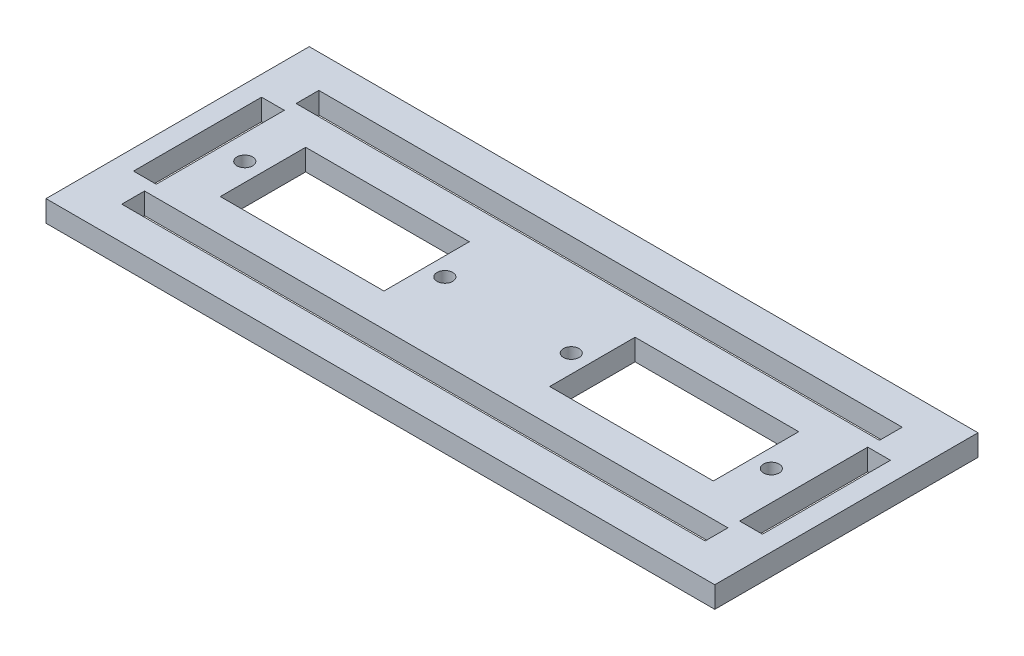
ISO-10303-21;
HEADER;
FILE_DESCRIPTION(('STEP AP214'),'2;1');
FILE_NAME('part.step','',(''),(''),'','','');
FILE_SCHEMA(('AUTOMOTIVE_DESIGN { 1 0 10303 214 1 1 1 1 }'));
ENDSEC;
DATA;
#1=APPLICATION_CONTEXT('core data for automotive mechanical design processes');
#2=APPLICATION_PROTOCOL_DEFINITION('international standard','automotive_design',2000,#1);
#3=PRODUCT_CONTEXT('',#1,'mechanical');
#4=PRODUCT('Part','Part','',(#3));
#5=PRODUCT_RELATED_PRODUCT_CATEGORY('part','',(#4));
#6=PRODUCT_DEFINITION_FORMATION('','',#4);
#7=PRODUCT_DEFINITION_CONTEXT('part definition',#1,'design');
#8=PRODUCT_DEFINITION('design','',#6,#7);
#9=PRODUCT_DEFINITION_SHAPE('','',#8);
#10=(LENGTH_UNIT() NAMED_UNIT(*) SI_UNIT(.MILLI.,.METRE.));
#11=(NAMED_UNIT(*) PLANE_ANGLE_UNIT() SI_UNIT($,.RADIAN.));
#12=(NAMED_UNIT(*) SI_UNIT($,.STERADIAN.) SOLID_ANGLE_UNIT());
#13=UNCERTAINTY_MEASURE_WITH_UNIT(LENGTH_MEASURE(1.E-05),#10,'distance_accuracy_value','');
#14=(GEOMETRIC_REPRESENTATION_CONTEXT(3) GLOBAL_UNCERTAINTY_ASSIGNED_CONTEXT((#13)) GLOBAL_UNIT_ASSIGNED_CONTEXT((#10,
#11,#12)) REPRESENTATION_CONTEXT('',''));
#15=CARTESIAN_POINT('',(0.,0.,0.));
#16=DIRECTION('',(0.,0.,1.));
#17=DIRECTION('',(1.,0.,0.));
#18=AXIS2_PLACEMENT_3D('',#15,#16,#17);
#19=CARTESIAN_POINT('',(0.,3.,0.));
#20=DIRECTION('',(0.,1.,0.));
#21=DIRECTION('',(0.,0.,1.));
#22=AXIS2_PLACEMENT_3D('',#19,#20,#21);
#23=PLANE('',#22);
#24=CARTESIAN_POINT('',(24.1355941596507,3.,-15.7865167565004));
#25=DIRECTION('',(0.,1.,0.));
#26=DIRECTION('',(0.,0.,1.));
#27=AXIS2_PLACEMENT_3D('',#24,#25,#26);
#28=CIRCLE('',#27,1.1);
#29=CARTESIAN_POINT('',(24.1355941596507,3.,-14.6865167565004));
#30=VERTEX_POINT('',#29);
#31=EDGE_CURVE('E258',#30,#30,#28,.T.);
#32=ORIENTED_EDGE('',*,*,#31,.F.);
#33=EDGE_LOOP('',(#32));
#34=FACE_BOUND('',#33,.T.);
#35=CARTESIAN_POINT('',(-22.1361326863291,3.,-16.1680050021519));
#36=DIRECTION('',(0.,1.,0.));
#37=DIRECTION('',(0.,0.,1.));
#38=AXIS2_PLACEMENT_3D('',#35,#36,#37);
#39=CIRCLE('',#38,1.1);
#40=CARTESIAN_POINT('',(-22.1361326863291,3.,-15.0680050021519));
#41=VERTEX_POINT('',#40);
#42=EDGE_CURVE('E274',#41,#41,#39,.T.);
#43=ORIENTED_EDGE('',*,*,#42,.F.);
#44=EDGE_LOOP('',(#43));
#45=FACE_BOUND('',#44,.T.);
#46=CARTESIAN_POINT('',(5.98386731367086,3.,-16.1680050021519));
#47=DIRECTION('',(0.,1.,0.));
#48=DIRECTION('',(0.,0.,1.));
#49=AXIS2_PLACEMENT_3D('',#46,#47,#48);
#50=CIRCLE('',#49,1.1);
#51=CARTESIAN_POINT('',(5.98386731367086,3.,-15.0680050021519));
#52=VERTEX_POINT('',#51);
#53=EDGE_CURVE('E298',#52,#52,#50,.T.);
#54=ORIENTED_EDGE('',*,*,#53,.F.);
#55=EDGE_LOOP('',(#54));
#56=FACE_BOUND('',#55,.T.);
#57=CARTESIAN_POINT('',(52.2555941596507,3.,-15.7865167565005));
#58=DIRECTION('',(0.,1.,0.));
#59=DIRECTION('',(0.,0.,1.));
#60=AXIS2_PLACEMENT_3D('',#57,#58,#59);
#61=CIRCLE('',#60,1.1);
#62=CARTESIAN_POINT('',(52.2555941596507,3.,-14.6865167565005));
#63=VERTEX_POINT('',#62);
#64=EDGE_CURVE('E255',#63,#63,#61,.T.);
#65=ORIENTED_EDGE('',*,*,#64,.F.);
#66=EDGE_LOOP('',(#65));
#67=FACE_BOUND('',#66,.T.);
#68=DIRECTION('',(0.,0.,1.));
#69=VECTOR('',#68,1.);
#70=CARTESIAN_POINT('',(26.6955941596507,3.,-10.1960238939657));
#71=LINE('',#70,#69);
#72=CARTESIAN_POINT('',(26.6955941596507,3.,-22.1960238939657));
#73=VERTEX_POINT('',#72);
#74=CARTESIAN_POINT('',(26.6955941596507,3.,-10.1960238939657));
#75=VERTEX_POINT('',#74);
#76=EDGE_CURVE('E53',#73,#75,#71,.T.);
#77=ORIENTED_EDGE('',*,*,#76,.F.);
#78=DIRECTION('',(-1.,0.,0.));
#79=VECTOR('',#78,1.);
#80=CARTESIAN_POINT('',(49.6955941596507,3.,-22.1960238939657));
#81=LINE('',#80,#79);
#82=CARTESIAN_POINT('',(49.6955941596507,3.,-22.1960238939657));
#83=VERTEX_POINT('',#82);
#84=EDGE_CURVE('E246',#83,#73,#81,.T.);
#85=ORIENTED_EDGE('',*,*,#84,.F.);
#86=DIRECTION('',(0.,0.,-1.));
#87=VECTOR('',#86,1.);
#88=CARTESIAN_POINT('',(49.6955941596507,3.,-10.1960238939657));
#89=LINE('',#88,#87);
#90=CARTESIAN_POINT('',(49.6955941596507,3.,-10.1960238939657));
#91=VERTEX_POINT('',#90);
#92=EDGE_CURVE('E230',#91,#83,#89,.T.);
#93=ORIENTED_EDGE('',*,*,#92,.F.);
#94=DIRECTION('',(1.,0.,0.));
#95=VECTOR('',#94,1.);
#96=CARTESIAN_POINT('',(49.6955941596507,3.,-10.1960238939657));
#97=LINE('',#96,#95);
#98=EDGE_CURVE('E240',#75,#91,#97,.T.);
#99=ORIENTED_EDGE('',*,*,#98,.F.);
#100=EDGE_LOOP('',(#77,#85,#93,#99));
#101=FACE_BOUND('',#100,.T.);
#102=DIRECTION('',(0.,0.,-1.));
#103=VECTOR('',#102,1.);
#104=CARTESIAN_POINT('',(59.6238673136707,3.,-25.1680050021519));
#105=LINE('',#104,#103);
#106=CARTESIAN_POINT('',(59.6238673136707,3.,-7.1680050021519));
#107=VERTEX_POINT('',#106);
#108=CARTESIAN_POINT('',(59.6238673136707,3.,-25.1680050021519));
#109=VERTEX_POINT('',#108);
#110=EDGE_CURVE('E61',#107,#109,#105,.T.);
#111=ORIENTED_EDGE('',*,*,#110,.F.);
#112=DIRECTION('',(1.,0.,0.));
#113=VECTOR('',#112,1.);
#114=CARTESIAN_POINT('',(56.4238673136707,3.,-7.1680050021519));
#115=LINE('',#114,#113);
#116=CARTESIAN_POINT('',(56.4238673136707,3.,-7.1680050021519));
#117=VERTEX_POINT('',#116);
#118=EDGE_CURVE('E288',#117,#107,#115,.T.);
#119=ORIENTED_EDGE('',*,*,#118,.F.);
#120=DIRECTION('',(0.,0.,1.));
#121=VECTOR('',#120,1.);
#122=CARTESIAN_POINT('',(56.4238673136707,3.,-25.1680050021519));
#123=LINE('',#122,#121);
#124=CARTESIAN_POINT('',(56.4238673136707,3.,-25.1680050021519));
#125=VERTEX_POINT('',#124);
#126=EDGE_CURVE('E285',#125,#117,#123,.T.);
#127=ORIENTED_EDGE('',*,*,#126,.F.);
#128=DIRECTION('',(-1.,0.,0.));
#129=VECTOR('',#128,1.);
#130=CARTESIAN_POINT('',(56.4238673136707,3.,-25.1680050021519));
#131=LINE('',#130,#129);
#132=EDGE_CURVE('E282',#109,#125,#131,.T.);
#133=ORIENTED_EDGE('',*,*,#132,.F.);
#134=EDGE_LOOP('',(#111,#119,#127,#133));
#135=FACE_BOUND('',#134,.T.);
#136=DIRECTION('',(0.,0.,1.));
#137=VECTOR('',#136,1.);
#138=CARTESIAN_POINT('',(-19.5761326863291,3.,-10.1680050021519));
#139=LINE('',#138,#137);
#140=CARTESIAN_POINT('',(-19.5761326863291,3.,-22.1680050021519));
#141=VERTEX_POINT('',#140);
#142=CARTESIAN_POINT('',(-19.5761326863291,3.,-10.1680050021519));
#143=VERTEX_POINT('',#142);
#144=EDGE_CURVE('E259',#141,#143,#139,.T.);
#145=ORIENTED_EDGE('',*,*,#144,.F.);
#146=DIRECTION('',(-1.,0.,0.));
#147=VECTOR('',#146,1.);
#148=CARTESIAN_POINT('',(3.42386731367086,3.,-22.1680050021519));
#149=LINE('',#148,#147);
#150=CARTESIAN_POINT('',(3.42386731367086,3.,-22.1680050021519));
#151=VERTEX_POINT('',#150);
#152=EDGE_CURVE('E268',#151,#141,#149,.T.);
#153=ORIENTED_EDGE('',*,*,#152,.F.);
#154=DIRECTION('',(0.,0.,-1.));
#155=VECTOR('',#154,1.);
#156=CARTESIAN_POINT('',(3.42386731367086,3.,-10.1680050021519));
#157=LINE('',#156,#155);
#158=CARTESIAN_POINT('',(3.42386731367086,3.,-10.1680050021519));
#159=VERTEX_POINT('',#158);
#160=EDGE_CURVE('E265',#159,#151,#157,.T.);
#161=ORIENTED_EDGE('',*,*,#160,.F.);
#162=DIRECTION('',(1.,0.,0.));
#163=VECTOR('',#162,1.);
#164=CARTESIAN_POINT('',(3.42386731367086,3.,-10.1680050021519));
#165=LINE('',#164,#163);
#166=EDGE_CURVE('E261',#143,#159,#165,.T.);
#167=ORIENTED_EDGE('',*,*,#166,.F.);
#168=EDGE_LOOP('',(#145,#153,#161,#167));
#169=FACE_BOUND('',#168,.T.);
#170=DIRECTION('',(1.,0.,0.));
#171=VECTOR('',#170,1.);
#172=CARTESIAN_POINT('',(-28.7761326863291,3.,-7.1680050021519));
#173=LINE('',#172,#171);
#174=CARTESIAN_POINT('',(-28.7761326863291,3.,-7.1680050021519));
#175=VERTEX_POINT('',#174);
#176=CARTESIAN_POINT('',(-25.5761326863291,3.,-7.1680050021519));
#177=VERTEX_POINT('',#176);
#178=EDGE_CURVE('E329',#175,#177,#173,.T.);
#179=ORIENTED_EDGE('',*,*,#178,.F.);
#180=DIRECTION('',(0.,0.,1.));
#181=VECTOR('',#180,1.);
#182=CARTESIAN_POINT('',(-28.7761326863291,3.,-25.1680050021519));
#183=LINE('',#182,#181);
#184=CARTESIAN_POINT('',(-28.7761326863291,3.,-25.1680050021519));
#185=VERTEX_POINT('',#184);
#186=EDGE_CURVE('E372',#185,#175,#183,.T.);
#187=ORIENTED_EDGE('',*,*,#186,.F.);
#188=DIRECTION('',(1.,0.,0.));
#189=VECTOR('',#188,1.);
#190=CARTESIAN_POINT('',(-28.7761326863291,3.,-25.1680050021519));
#191=LINE('',#190,#189);
#192=CARTESIAN_POINT('',(-25.5761326863291,3.,-25.1680050021519));
#193=VERTEX_POINT('',#192);
#194=EDGE_CURVE('E385',#185,#193,#191,.T.);
#195=ORIENTED_EDGE('',*,*,#194,.T.);
#196=DIRECTION('',(0.,0.,1.));
#197=VECTOR('',#196,1.);
#198=CARTESIAN_POINT('',(-25.5761326863291,3.,-25.1680050021519));
#199=LINE('',#198,#197);
#200=EDGE_CURVE('E382',#193,#177,#199,.T.);
#201=ORIENTED_EDGE('',*,*,#200,.T.);
#202=EDGE_LOOP('',(#179,#187,#195,#201));
#203=FACE_BOUND('',#202,.T.);
#204=DIRECTION('',(0.,0.,-1.));
#205=VECTOR('',#204,1.);
#206=CARTESIAN_POINT('',(62.4238673136709,3.,-34.6680050021519));
#207=LINE('',#206,#205);
#208=CARTESIAN_POINT('',(62.4238673136709,3.,2.3319949978481));
#209=VERTEX_POINT('',#208);
#210=CARTESIAN_POINT('',(62.4238673136709,3.,-34.6680050021519));
#211=VERTEX_POINT('',#210);
#212=EDGE_CURVE('E399',#209,#211,#207,.T.);
#213=ORIENTED_EDGE('',*,*,#212,.T.);
#214=DIRECTION('',(-1.,0.,0.));
#215=VECTOR('',#214,1.);
#216=CARTESIAN_POINT('',(-31.5761326863291,3.,-34.6680050021519));
#217=LINE('',#216,#215);
#218=CARTESIAN_POINT('',(-31.5761326863291,3.,-34.6680050021519));
#219=VERTEX_POINT('',#218);
#220=EDGE_CURVE('E402',#211,#219,#217,.T.);
#221=ORIENTED_EDGE('',*,*,#220,.T.);
#222=DIRECTION('',(0.,0.,1.));
#223=VECTOR('',#222,1.);
#224=CARTESIAN_POINT('',(-31.5761326863291,3.,-34.6680050021519));
#225=LINE('',#224,#223);
#226=CARTESIAN_POINT('',(-31.5761326863291,3.,2.3319949978481));
#227=VERTEX_POINT('',#226);
#228=EDGE_CURVE('E405',#219,#227,#225,.T.);
#229=ORIENTED_EDGE('',*,*,#228,.T.);
#230=DIRECTION('',(1.,0.,0.));
#231=VECTOR('',#230,1.);
#232=CARTESIAN_POINT('',(-31.5761326863291,3.,2.3319949978481));
#233=LINE('',#232,#231);
#234=EDGE_CURVE('E407',#227,#209,#233,.T.);
#235=ORIENTED_EDGE('',*,*,#234,.T.);
#236=EDGE_LOOP('',(#213,#221,#229,#235));
#237=FACE_BOUND('',#236,.T.);
#238=DIRECTION('',(-1.,0.,0.));
#239=VECTOR('',#238,1.);
#240=CARTESIAN_POINT('',(56.4238673136709,3.,-30.0180050021517));
#241=LINE('',#240,#239);
#242=CARTESIAN_POINT('',(56.4238673136709,3.,-30.0180050021517));
#243=VERTEX_POINT('',#242);
#244=CARTESIAN_POINT('',(-25.5761326863291,3.,-30.0180050021517));
#245=VERTEX_POINT('',#244);
#246=EDGE_CURVE('E316',#243,#245,#241,.T.);
#247=ORIENTED_EDGE('',*,*,#246,.F.);
#248=DIRECTION('',(0.,0.,1.));
#249=VECTOR('',#248,1.);
#250=CARTESIAN_POINT('',(56.4238673136709,3.,-30.0180050021517));
#251=LINE('',#250,#249);
#252=CARTESIAN_POINT('',(56.4238673136709,3.,-26.8180050021518));
#253=VERTEX_POINT('',#252);
#254=EDGE_CURVE('E326',#243,#253,#251,.T.);
#255=ORIENTED_EDGE('',*,*,#254,.T.);
#256=DIRECTION('',(-1.,0.,0.));
#257=VECTOR('',#256,1.);
#258=CARTESIAN_POINT('',(56.4238673136709,3.,-26.8180050021518));
#259=LINE('',#258,#257);
#260=CARTESIAN_POINT('',(-25.5761326863291,3.,-26.8180050021517));
#261=VERTEX_POINT('',#260);
#262=EDGE_CURVE('E323',#253,#261,#259,.T.);
#263=ORIENTED_EDGE('',*,*,#262,.T.);
#264=DIRECTION('',(0.,0.,-1.));
#265=VECTOR('',#264,1.);
#266=CARTESIAN_POINT('',(-25.5761326863291,3.,-26.8180050021517));
#267=LINE('',#266,#265);
#268=EDGE_CURVE('E319',#261,#245,#267,.T.);
#269=ORIENTED_EDGE('',*,*,#268,.T.);
#270=EDGE_LOOP('',(#247,#255,#263,#269));
#271=FACE_BOUND('',#270,.T.);
#272=DIRECTION('',(0.,0.,1.));
#273=VECTOR('',#272,1.);
#274=CARTESIAN_POINT('',(56.4238673136709,3.,-5.51800500215183));
#275=LINE('',#274,#273);
#276=CARTESIAN_POINT('',(56.4238673136709,3.,-5.51800500215183));
#277=VERTEX_POINT('',#276);
#278=CARTESIAN_POINT('',(56.4238673136709,3.,-2.3180050021519));
#279=VERTEX_POINT('',#278);
#280=EDGE_CURVE('E348',#277,#279,#275,.T.);
#281=ORIENTED_EDGE('',*,*,#280,.T.);
#282=DIRECTION('',(-1.,0.,0.));
#283=VECTOR('',#282,1.);
#284=CARTESIAN_POINT('',(56.4238673136709,3.,-2.3180050021519));
#285=LINE('',#284,#283);
#286=CARTESIAN_POINT('',(-25.5761326863292,3.,-2.31800500215189));
#287=VERTEX_POINT('',#286);
#288=EDGE_CURVE('E308',#279,#287,#285,.T.);
#289=ORIENTED_EDGE('',*,*,#288,.T.);
#290=DIRECTION('',(0.,0.,1.));
#291=VECTOR('',#290,1.);
#292=CARTESIAN_POINT('',(-25.5761326863291,3.,-5.51800500215182));
#293=LINE('',#292,#291);
#294=CARTESIAN_POINT('',(-25.5761326863291,3.,-5.51800500215182));
#295=VERTEX_POINT('',#294);
#296=EDGE_CURVE('E355',#295,#287,#293,.T.);
#297=ORIENTED_EDGE('',*,*,#296,.F.);
#298=DIRECTION('',(-1.,0.,0.));
#299=VECTOR('',#298,1.);
#300=CARTESIAN_POINT('',(56.4238673136709,3.,-5.51800500215183));
#301=LINE('',#300,#299);
#302=EDGE_CURVE('E351',#277,#295,#301,.T.);
#303=ORIENTED_EDGE('',*,*,#302,.F.);
#304=EDGE_LOOP('',(#281,#289,#297,#303));
#305=FACE_BOUND('',#304,.T.);
#306=ADVANCED_FACE('F36',(#34,#45,#56,#67,#101,#135,#169,#203,#237,#271,#305),#23,.T.);
#307=CARTESIAN_POINT('',(0.,0.,0.));
#308=DIRECTION('',(0.,1.,0.));
#309=DIRECTION('',(0.,0.,1.));
#310=AXIS2_PLACEMENT_3D('',#307,#308,#309);
#311=PLANE('',#310);
#312=CARTESIAN_POINT('',(24.1355941596507,0.,-15.7865167565004));
#313=DIRECTION('',(0.,1.,0.));
#314=DIRECTION('',(0.,0.,1.));
#315=AXIS2_PLACEMENT_3D('',#312,#313,#314);
#316=CIRCLE('',#315,1.1);
#317=CARTESIAN_POINT('',(24.1355941596507,0.,-14.6865167565004));
#318=VERTEX_POINT('',#317);
#319=EDGE_CURVE('E40',#318,#318,#316,.T.);
#320=ORIENTED_EDGE('',*,*,#319,.T.);
#321=EDGE_LOOP('',(#320));
#322=FACE_BOUND('',#321,.T.);
#323=CARTESIAN_POINT('',(-22.1361326863291,0.,-16.1680050021519));
#324=DIRECTION('',(0.,1.,0.));
#325=DIRECTION('',(0.,0.,1.));
#326=AXIS2_PLACEMENT_3D('',#323,#324,#325);
#327=CIRCLE('',#326,1.1);
#328=CARTESIAN_POINT('',(-22.1361326863291,0.,-15.0680050021519));
#329=VERTEX_POINT('',#328);
#330=EDGE_CURVE('E461',#329,#329,#327,.T.);
#331=ORIENTED_EDGE('',*,*,#330,.T.);
#332=EDGE_LOOP('',(#331));
#333=FACE_BOUND('',#332,.T.);
#334=CARTESIAN_POINT('',(5.98386731367086,0.,-16.1680050021519));
#335=DIRECTION('',(0.,1.,0.));
#336=DIRECTION('',(0.,0.,1.));
#337=AXIS2_PLACEMENT_3D('',#334,#335,#336);
#338=CIRCLE('',#337,1.1);
#339=CARTESIAN_POINT('',(5.98386731367086,0.,-15.0680050021519));
#340=VERTEX_POINT('',#339);
#341=EDGE_CURVE('E459',#340,#340,#338,.T.);
#342=ORIENTED_EDGE('',*,*,#341,.T.);
#343=EDGE_LOOP('',(#342));
#344=FACE_BOUND('',#343,.T.);
#345=CARTESIAN_POINT('',(52.2555941596507,0.,-15.7865167565005));
#346=DIRECTION('',(0.,1.,0.));
#347=DIRECTION('',(0.,0.,1.));
#348=AXIS2_PLACEMENT_3D('',#345,#346,#347);
#349=CIRCLE('',#348,1.1);
#350=CARTESIAN_POINT('',(52.2555941596507,0.,-14.6865167565005));
#351=VERTEX_POINT('',#350);
#352=EDGE_CURVE('E301',#351,#351,#349,.T.);
#353=ORIENTED_EDGE('',*,*,#352,.T.);
#354=EDGE_LOOP('',(#353));
#355=FACE_BOUND('',#354,.T.);
#356=DIRECTION('',(-1.,0.,0.));
#357=VECTOR('',#356,1.);
#358=CARTESIAN_POINT('',(0.,0.,-22.1960238939657));
#359=LINE('',#358,#357);
#360=CARTESIAN_POINT('',(49.6955941596507,0.,-22.1960238939657));
#361=VERTEX_POINT('',#360);
#362=CARTESIAN_POINT('',(26.6955941596507,0.,-22.1960238939657));
#363=VERTEX_POINT('',#362);
#364=EDGE_CURVE('E45',#361,#363,#359,.T.);
#365=ORIENTED_EDGE('',*,*,#364,.T.);
#366=DIRECTION('',(0.,0.,1.));
#367=VECTOR('',#366,1.);
#368=CARTESIAN_POINT('',(26.6955941596507,0.,0.));
#369=LINE('',#368,#367);
#370=CARTESIAN_POINT('',(26.6955941596507,0.,-10.1960238939657));
#371=VERTEX_POINT('',#370);
#372=EDGE_CURVE('E11',#363,#371,#369,.T.);
#373=ORIENTED_EDGE('',*,*,#372,.T.);
#374=DIRECTION('',(1.,0.,0.));
#375=VECTOR('',#374,1.);
#376=CARTESIAN_POINT('',(0.,0.,-10.1960238939657));
#377=LINE('',#376,#375);
#378=CARTESIAN_POINT('',(49.6955941596507,0.,-10.1960238939657));
#379=VERTEX_POINT('',#378);
#380=EDGE_CURVE('E452',#371,#379,#377,.T.);
#381=ORIENTED_EDGE('',*,*,#380,.T.);
#382=DIRECTION('',(0.,0.,-1.));
#383=VECTOR('',#382,1.);
#384=CARTESIAN_POINT('',(49.6955941596507,0.,0.));
#385=LINE('',#384,#383);
#386=EDGE_CURVE('E233',#379,#361,#385,.T.);
#387=ORIENTED_EDGE('',*,*,#386,.T.);
#388=EDGE_LOOP('',(#365,#373,#381,#387));
#389=FACE_BOUND('',#388,.T.);
#390=DIRECTION('',(1.,0.,0.));
#391=VECTOR('',#390,1.);
#392=CARTESIAN_POINT('',(0.,0.,-7.1680050021519));
#393=LINE('',#392,#391);
#394=CARTESIAN_POINT('',(56.4238673136707,0.,-7.1680050021519));
#395=VERTEX_POINT('',#394);
#396=CARTESIAN_POINT('',(59.6238673136707,0.,-7.1680050021519));
#397=VERTEX_POINT('',#396);
#398=EDGE_CURVE('E446',#395,#397,#393,.T.);
#399=ORIENTED_EDGE('',*,*,#398,.T.);
#400=DIRECTION('',(0.,0.,-1.));
#401=VECTOR('',#400,1.);
#402=CARTESIAN_POINT('',(59.6238673136707,0.,0.));
#403=LINE('',#402,#401);
#404=CARTESIAN_POINT('',(59.6238673136707,0.,-25.1680050021519));
#405=VERTEX_POINT('',#404);
#406=EDGE_CURVE('E449',#397,#405,#403,.T.);
#407=ORIENTED_EDGE('',*,*,#406,.T.);
#408=DIRECTION('',(-1.,0.,0.));
#409=VECTOR('',#408,1.);
#410=CARTESIAN_POINT('',(0.,0.,-25.1680050021519));
#411=LINE('',#410,#409);
#412=CARTESIAN_POINT('',(56.4238673136707,0.,-25.1680050021519));
#413=VERTEX_POINT('',#412);
#414=EDGE_CURVE('E440',#405,#413,#411,.T.);
#415=ORIENTED_EDGE('',*,*,#414,.T.);
#416=DIRECTION('',(0.,0.,1.));
#417=VECTOR('',#416,1.);
#418=CARTESIAN_POINT('',(56.4238673136707,0.,0.));
#419=LINE('',#418,#417);
#420=EDGE_CURVE('E443',#413,#395,#419,.T.);
#421=ORIENTED_EDGE('',*,*,#420,.T.);
#422=EDGE_LOOP('',(#399,#407,#415,#421));
#423=FACE_BOUND('',#422,.T.);
#424=DIRECTION('',(-1.,0.,0.));
#425=VECTOR('',#424,1.);
#426=CARTESIAN_POINT('',(0.,0.,-22.1680050021519));
#427=LINE('',#426,#425);
#428=CARTESIAN_POINT('',(3.42386731367086,0.,-22.1680050021519));
#429=VERTEX_POINT('',#428);
#430=CARTESIAN_POINT('',(-19.5761326863291,0.,-22.1680050021519));
#431=VERTEX_POINT('',#430);
#432=EDGE_CURVE('E434',#429,#431,#427,.T.);
#433=ORIENTED_EDGE('',*,*,#432,.T.);
#434=DIRECTION('',(0.,0.,1.));
#435=VECTOR('',#434,1.);
#436=CARTESIAN_POINT('',(-19.5761326863291,0.,0.));
#437=LINE('',#436,#435);
#438=CARTESIAN_POINT('',(-19.5761326863291,0.,-10.1680050021519));
#439=VERTEX_POINT('',#438);
#440=EDGE_CURVE('E437',#431,#439,#437,.T.);
#441=ORIENTED_EDGE('',*,*,#440,.T.);
#442=DIRECTION('',(1.,0.,0.));
#443=VECTOR('',#442,1.);
#444=CARTESIAN_POINT('',(0.,0.,-10.1680050021519));
#445=LINE('',#444,#443);
#446=CARTESIAN_POINT('',(3.42386731367086,0.,-10.1680050021519));
#447=VERTEX_POINT('',#446);
#448=EDGE_CURVE('E428',#439,#447,#445,.T.);
#449=ORIENTED_EDGE('',*,*,#448,.T.);
#450=DIRECTION('',(0.,0.,-1.));
#451=VECTOR('',#450,1.);
#452=CARTESIAN_POINT('',(3.42386731367086,0.,0.));
#453=LINE('',#452,#451);
#454=EDGE_CURVE('E431',#447,#429,#453,.T.);
#455=ORIENTED_EDGE('',*,*,#454,.T.);
#456=EDGE_LOOP('',(#433,#441,#449,#455));
#457=FACE_BOUND('',#456,.T.);
#458=DIRECTION('',(0.,0.,1.));
#459=VECTOR('',#458,1.);
#460=CARTESIAN_POINT('',(56.4238673136709,0.,-30.0180050021517));
#461=LINE('',#460,#459);
#462=CARTESIAN_POINT('',(56.4238673136709,0.,-30.0180050021517));
#463=VERTEX_POINT('',#462);
#464=CARTESIAN_POINT('',(56.4238673136709,0.,-26.8180050021518));
#465=VERTEX_POINT('',#464);
#466=EDGE_CURVE('E320',#463,#465,#461,.T.);
#467=ORIENTED_EDGE('',*,*,#466,.F.);
#468=DIRECTION('',(-1.,0.,0.));
#469=VECTOR('',#468,1.);
#470=CARTESIAN_POINT('',(56.4238673136709,0.,-30.0180050021517));
#471=LINE('',#470,#469);
#472=CARTESIAN_POINT('',(-25.5761326863291,0.,-30.0180050021517));
#473=VERTEX_POINT('',#472);
#474=EDGE_CURVE('E315',#463,#473,#471,.T.);
#475=ORIENTED_EDGE('',*,*,#474,.T.);
#476=DIRECTION('',(0.,0.,-1.));
#477=VECTOR('',#476,1.);
#478=CARTESIAN_POINT('',(-25.5761326863291,0.,-26.8180050021517));
#479=LINE('',#478,#477);
#480=CARTESIAN_POINT('',(-25.5761326863291,0.,-26.8180050021517));
#481=VERTEX_POINT('',#480);
#482=EDGE_CURVE('E332',#481,#473,#479,.T.);
#483=ORIENTED_EDGE('',*,*,#482,.F.);
#484=DIRECTION('',(-1.,0.,0.));
#485=VECTOR('',#484,1.);
#486=CARTESIAN_POINT('',(56.4238673136709,0.,-26.8180050021518));
#487=LINE('',#486,#485);
#488=EDGE_CURVE('E335',#465,#481,#487,.T.);
#489=ORIENTED_EDGE('',*,*,#488,.F.);
#490=EDGE_LOOP('',(#467,#475,#483,#489));
#491=FACE_BOUND('',#490,.T.);
#492=DIRECTION('',(0.,0.,1.));
#493=VECTOR('',#492,1.);
#494=CARTESIAN_POINT('',(-28.7761326863291,0.,-25.1680050021519));
#495=LINE('',#494,#493);
#496=CARTESIAN_POINT('',(-28.7761326863291,0.,-25.1680050021519));
#497=VERTEX_POINT('',#496);
#498=CARTESIAN_POINT('',(-28.7761326863291,0.,-7.1680050021519));
#499=VERTEX_POINT('',#498);
#500=EDGE_CURVE('E377',#497,#499,#495,.T.);
#501=ORIENTED_EDGE('',*,*,#500,.T.);
#502=DIRECTION('',(1.,0.,0.));
#503=VECTOR('',#502,1.);
#504=CARTESIAN_POINT('',(-28.7761326863291,0.,-7.1680050021519));
#505=LINE('',#504,#503);
#506=CARTESIAN_POINT('',(-25.5761326863291,0.,-7.1680050021519));
#507=VERTEX_POINT('',#506);
#508=EDGE_CURVE('E368',#499,#507,#505,.T.);
#509=ORIENTED_EDGE('',*,*,#508,.T.);
#510=DIRECTION('',(0.,0.,1.));
#511=VECTOR('',#510,1.);
#512=CARTESIAN_POINT('',(-25.5761326863291,0.,-25.1680050021519));
#513=LINE('',#512,#511);
#514=CARTESIAN_POINT('',(-25.5761326863291,0.,-25.1680050021519));
#515=VERTEX_POINT('',#514);
#516=EDGE_CURVE('E371',#515,#507,#513,.T.);
#517=ORIENTED_EDGE('',*,*,#516,.F.);
#518=DIRECTION('',(1.,0.,0.));
#519=VECTOR('',#518,1.);
#520=CARTESIAN_POINT('',(-28.7761326863291,0.,-25.1680050021519));
#521=LINE('',#520,#519);
#522=EDGE_CURVE('E374',#497,#515,#521,.T.);
#523=ORIENTED_EDGE('',*,*,#522,.F.);
#524=EDGE_LOOP('',(#501,#509,#517,#523));
#525=FACE_BOUND('',#524,.T.);
#526=DIRECTION('',(0.,0.,-1.));
#527=VECTOR('',#526,1.);
#528=CARTESIAN_POINT('',(62.4238673136709,0.,-34.6680050021519));
#529=LINE('',#528,#527);
#530=CARTESIAN_POINT('',(62.4238673136709,0.,2.3319949978481));
#531=VERTEX_POINT('',#530);
#532=CARTESIAN_POINT('',(62.4238673136709,0.,-34.6680050021519));
#533=VERTEX_POINT('',#532);
#534=EDGE_CURVE('E392',#531,#533,#529,.T.);
#535=ORIENTED_EDGE('',*,*,#534,.F.);
#536=DIRECTION('',(1.,0.,0.));
#537=VECTOR('',#536,1.);
#538=CARTESIAN_POINT('',(-31.5761326863291,0.,2.3319949978481));
#539=LINE('',#538,#537);
#540=CARTESIAN_POINT('',(-31.5761326863291,0.,2.3319949978481));
#541=VERTEX_POINT('',#540);
#542=EDGE_CURVE('E403',#541,#531,#539,.T.);
#543=ORIENTED_EDGE('',*,*,#542,.F.);
#544=DIRECTION('',(0.,0.,1.));
#545=VECTOR('',#544,1.);
#546=CARTESIAN_POINT('',(-31.5761326863291,0.,-34.6680050021519));
#547=LINE('',#546,#545);
#548=CARTESIAN_POINT('',(-31.5761326863291,0.,-34.6680050021519));
#549=VERTEX_POINT('',#548);
#550=EDGE_CURVE('E414',#549,#541,#547,.T.);
#551=ORIENTED_EDGE('',*,*,#550,.F.);
#552=DIRECTION('',(-1.,0.,0.));
#553=VECTOR('',#552,1.);
#554=CARTESIAN_POINT('',(-31.5761326863291,0.,-34.6680050021519));
#555=LINE('',#554,#553);
#556=EDGE_CURVE('E412',#533,#549,#555,.T.);
#557=ORIENTED_EDGE('',*,*,#556,.F.);
#558=EDGE_LOOP('',(#535,#543,#551,#557));
#559=FACE_BOUND('',#558,.T.);
#560=DIRECTION('',(-1.,0.,0.));
#561=VECTOR('',#560,1.);
#562=CARTESIAN_POINT('',(56.4238673136709,0.,-2.3180050021519));
#563=LINE('',#562,#561);
#564=CARTESIAN_POINT('',(56.4238673136709,0.,-2.3180050021519));
#565=VERTEX_POINT('',#564);
#566=CARTESIAN_POINT('',(-25.5761326863292,0.,-2.31800500215189));
#567=VERTEX_POINT('',#566);
#568=EDGE_CURVE('E352',#565,#567,#563,.T.);
#569=ORIENTED_EDGE('',*,*,#568,.F.);
#570=DIRECTION('',(0.,0.,1.));
#571=VECTOR('',#570,1.);
#572=CARTESIAN_POINT('',(56.4238673136709,0.,-5.51800500215183));
#573=LINE('',#572,#571);
#574=CARTESIAN_POINT('',(56.4238673136709,0.,-5.51800500215183));
#575=VERTEX_POINT('',#574);
#576=EDGE_CURVE('E347',#575,#565,#573,.T.);
#577=ORIENTED_EDGE('',*,*,#576,.F.);
#578=DIRECTION('',(-1.,0.,0.));
#579=VECTOR('',#578,1.);
#580=CARTESIAN_POINT('',(56.4238673136709,0.,-5.51800500215183));
#581=LINE('',#580,#579);
#582=CARTESIAN_POINT('',(-25.5761326863291,0.,-5.51800500215182));
#583=VERTEX_POINT('',#582);
#584=EDGE_CURVE('E361',#575,#583,#581,.T.);
#585=ORIENTED_EDGE('',*,*,#584,.T.);
#586=DIRECTION('',(0.,0.,1.));
#587=VECTOR('',#586,1.);
#588=CARTESIAN_POINT('',(-25.5761326863291,0.,-5.51800500215182));
#589=LINE('',#588,#587);
#590=EDGE_CURVE('E364',#583,#567,#589,.T.);
#591=ORIENTED_EDGE('',*,*,#590,.T.);
#592=EDGE_LOOP('',(#569,#577,#585,#591));
#593=FACE_BOUND('',#592,.T.);
#594=ADVANCED_FACE('F468',(#322,#333,#344,#355,#389,#423,#457,#491,#525,#559,#593),#311,.F.);
#595=CARTESIAN_POINT('',(62.4238673136709,3.,-34.6680050021519));
#596=DIRECTION('',(-1.,0.,0.));
#597=DIRECTION('',(0.,0.,1.));
#598=AXIS2_PLACEMENT_3D('',#595,#596,#597);
#599=PLANE('',#598);
#600=ORIENTED_EDGE('',*,*,#534,.T.);
#601=DIRECTION('',(0.,-1.,0.));
#602=VECTOR('',#601,1.);
#603=CARTESIAN_POINT('',(62.4238673136709,3.,-34.6680050021519));
#604=LINE('',#603,#602);
#605=EDGE_CURVE('E425',#211,#533,#604,.T.);
#606=ORIENTED_EDGE('',*,*,#605,.F.);
#607=ORIENTED_EDGE('',*,*,#212,.F.);
#608=DIRECTION('',(0.,-1.,0.));
#609=VECTOR('',#608,1.);
#610=CARTESIAN_POINT('',(62.4238673136709,3.,2.3319949978481));
#611=LINE('',#610,#609);
#612=EDGE_CURVE('E409',#209,#531,#611,.T.);
#613=ORIENTED_EDGE('',*,*,#612,.T.);
#614=EDGE_LOOP('',(#600,#606,#607,#613));
#615=FACE_BOUND('',#614,.T.);
#616=ADVANCED_FACE('F38',(#615),#599,.F.);
#617=CARTESIAN_POINT('',(-31.5761326863291,3.,-34.6680050021519));
#618=DIRECTION('',(0.,0.,1.));
#619=DIRECTION('',(1.,0.,0.));
#620=AXIS2_PLACEMENT_3D('',#617,#618,#619);
#621=PLANE('',#620);
#622=ORIENTED_EDGE('',*,*,#556,.T.);
#623=DIRECTION('',(0.,-1.,0.));
#624=VECTOR('',#623,1.);
#625=CARTESIAN_POINT('',(-31.5761326863291,3.,-34.6680050021519));
#626=LINE('',#625,#624);
#627=EDGE_CURVE('E422',#219,#549,#626,.T.);
#628=ORIENTED_EDGE('',*,*,#627,.F.);
#629=ORIENTED_EDGE('',*,*,#220,.F.);
#630=ORIENTED_EDGE('',*,*,#605,.T.);
#631=EDGE_LOOP('',(#622,#628,#629,#630));
#632=FACE_BOUND('',#631,.T.);
#633=ADVANCED_FACE('F502',(#632),#621,.F.);
#634=CARTESIAN_POINT('',(-31.5761326863291,3.,-34.6680050021519));
#635=DIRECTION('',(1.,0.,0.));
#636=DIRECTION('',(0.,0.,-1.));
#637=AXIS2_PLACEMENT_3D('',#634,#635,#636);
#638=PLANE('',#637);
#639=ORIENTED_EDGE('',*,*,#550,.T.);
#640=DIRECTION('',(0.,-1.,0.));
#641=VECTOR('',#640,1.);
#642=CARTESIAN_POINT('',(-31.5761326863291,3.,2.3319949978481));
#643=LINE('',#642,#641);
#644=EDGE_CURVE('E419',#227,#541,#643,.T.);
#645=ORIENTED_EDGE('',*,*,#644,.F.);
#646=ORIENTED_EDGE('',*,*,#228,.F.);
#647=ORIENTED_EDGE('',*,*,#627,.T.);
#648=EDGE_LOOP('',(#639,#645,#646,#647));
#649=FACE_BOUND('',#648,.T.);
#650=ADVANCED_FACE('F499',(#649),#638,.F.);
#651=CARTESIAN_POINT('',(-31.5761326863291,3.,2.3319949978481));
#652=DIRECTION('',(0.,0.,-1.));
#653=DIRECTION('',(-1.,0.,0.));
#654=AXIS2_PLACEMENT_3D('',#651,#652,#653);
#655=PLANE('',#654);
#656=ORIENTED_EDGE('',*,*,#542,.T.);
#657=ORIENTED_EDGE('',*,*,#612,.F.);
#658=ORIENTED_EDGE('',*,*,#234,.F.);
#659=ORIENTED_EDGE('',*,*,#644,.T.);
#660=EDGE_LOOP('',(#656,#657,#658,#659));
#661=FACE_BOUND('',#660,.T.);
#662=ADVANCED_FACE('F496',(#661),#655,.F.);
#663=CARTESIAN_POINT('',(-28.7761326863291,0.,-7.1680050021519));
#664=DIRECTION('',(0.,0.,1.));
#665=DIRECTION('',(1.,0.,0.));
#666=AXIS2_PLACEMENT_3D('',#663,#664,#665);
#667=PLANE('',#666);
#668=ORIENTED_EDGE('',*,*,#178,.T.);
#669=DIRECTION('',(0.,1.,0.));
#670=VECTOR('',#669,1.);
#671=CARTESIAN_POINT('',(-25.5761326863291,0.,-7.1680050021519));
#672=LINE('',#671,#670);
#673=EDGE_CURVE('E380',#507,#177,#672,.T.);
#674=ORIENTED_EDGE('',*,*,#673,.F.);
#675=ORIENTED_EDGE('',*,*,#508,.F.);
#676=DIRECTION('',(0.,1.,0.));
#677=VECTOR('',#676,1.);
#678=CARTESIAN_POINT('',(-28.7761326863291,0.,-7.1680050021519));
#679=LINE('',#678,#677);
#680=EDGE_CURVE('E390',#499,#175,#679,.T.);
#681=ORIENTED_EDGE('',*,*,#680,.T.);
#682=EDGE_LOOP('',(#668,#674,#675,#681));
#683=FACE_BOUND('',#682,.T.);
#684=ADVANCED_FACE('F493',(#683),#667,.F.);
#685=CARTESIAN_POINT('',(-28.7761326863291,0.,-25.1680050021519));
#686=DIRECTION('',(-1.,0.,0.));
#687=DIRECTION('',(0.,0.,1.));
#688=AXIS2_PLACEMENT_3D('',#685,#686,#687);
#689=PLANE('',#688);
#690=ORIENTED_EDGE('',*,*,#186,.T.);
#691=ORIENTED_EDGE('',*,*,#680,.F.);
#692=ORIENTED_EDGE('',*,*,#500,.F.);
#693=DIRECTION('',(0.,1.,0.));
#694=VECTOR('',#693,1.);
#695=CARTESIAN_POINT('',(-28.7761326863291,0.,-25.1680050021519));
#696=LINE('',#695,#694);
#697=EDGE_CURVE('E393',#497,#185,#696,.T.);
#698=ORIENTED_EDGE('',*,*,#697,.T.);
#699=EDGE_LOOP('',(#690,#691,#692,#698));
#700=FACE_BOUND('',#699,.T.);
#701=ADVANCED_FACE('F554',(#700),#689,.F.);
#702=CARTESIAN_POINT('',(-28.7761326863291,0.,-25.1680050021519));
#703=DIRECTION('',(0.,0.,1.));
#704=DIRECTION('',(1.,0.,0.));
#705=AXIS2_PLACEMENT_3D('',#702,#703,#704);
#706=PLANE('',#705);
#707=ORIENTED_EDGE('',*,*,#194,.F.);
#708=ORIENTED_EDGE('',*,*,#697,.F.);
#709=ORIENTED_EDGE('',*,*,#522,.T.);
#710=DIRECTION('',(0.,1.,0.));
#711=VECTOR('',#710,1.);
#712=CARTESIAN_POINT('',(-25.5761326863291,0.,-25.1680050021519));
#713=LINE('',#712,#711);
#714=EDGE_CURVE('E395',#515,#193,#713,.T.);
#715=ORIENTED_EDGE('',*,*,#714,.T.);
#716=EDGE_LOOP('',(#707,#708,#709,#715));
#717=FACE_BOUND('',#716,.T.);
#718=ADVANCED_FACE('F557',(#717),#706,.T.);
#719=CARTESIAN_POINT('',(-25.5761326863291,0.,-25.1680050021519));
#720=DIRECTION('',(-1.,0.,0.));
#721=DIRECTION('',(0.,0.,1.));
#722=AXIS2_PLACEMENT_3D('',#719,#720,#721);
#723=PLANE('',#722);
#724=ORIENTED_EDGE('',*,*,#200,.F.);
#725=ORIENTED_EDGE('',*,*,#714,.F.);
#726=ORIENTED_EDGE('',*,*,#516,.T.);
#727=ORIENTED_EDGE('',*,*,#673,.T.);
#728=EDGE_LOOP('',(#724,#725,#726,#727));
#729=FACE_BOUND('',#728,.T.);
#730=ADVANCED_FACE('F560',(#729),#723,.T.);
#731=CARTESIAN_POINT('',(56.4238673136709,0.,-30.0180050021517));
#732=DIRECTION('',(-1.,0.,0.));
#733=DIRECTION('',(0.,0.,1.));
#734=AXIS2_PLACEMENT_3D('',#731,#732,#733);
#735=PLANE('',#734);
#736=ORIENTED_EDGE('',*,*,#254,.F.);
#737=DIRECTION('',(0.,1.,0.));
#738=VECTOR('',#737,1.);
#739=CARTESIAN_POINT('',(56.4238673136709,0.,-30.0180050021517));
#740=LINE('',#739,#738);
#741=EDGE_CURVE('E312',#463,#243,#740,.T.);
#742=ORIENTED_EDGE('',*,*,#741,.F.);
#743=ORIENTED_EDGE('',*,*,#466,.T.);
#744=DIRECTION('',(0.,1.,0.));
#745=VECTOR('',#744,1.);
#746=CARTESIAN_POINT('',(56.4238673136709,0.,-26.8180050021518));
#747=LINE('',#746,#745);
#748=EDGE_CURVE('E304',#465,#253,#747,.T.);
#749=ORIENTED_EDGE('',*,*,#748,.T.);
#750=EDGE_LOOP('',(#736,#742,#743,#749));
#751=FACE_BOUND('',#750,.T.);
#752=ADVANCED_FACE('F563',(#751),#735,.T.);
#753=CARTESIAN_POINT('',(56.4238673136709,0.,-26.8180050021518));
#754=DIRECTION('',(0.,0.,-1.));
#755=DIRECTION('',(-1.,0.,0.));
#756=AXIS2_PLACEMENT_3D('',#753,#754,#755);
#757=PLANE('',#756);
#758=ORIENTED_EDGE('',*,*,#262,.F.);
#759=ORIENTED_EDGE('',*,*,#748,.F.);
#760=ORIENTED_EDGE('',*,*,#488,.T.);
#761=DIRECTION('',(0.,1.,0.));
#762=VECTOR('',#761,1.);
#763=CARTESIAN_POINT('',(-25.5761326863291,0.,-26.8180050021517));
#764=LINE('',#763,#762);
#765=EDGE_CURVE('E307',#481,#261,#764,.T.);
#766=ORIENTED_EDGE('',*,*,#765,.T.);
#767=EDGE_LOOP('',(#758,#759,#760,#766));
#768=FACE_BOUND('',#767,.T.);
#769=ADVANCED_FACE('F568',(#768),#757,.T.);
#770=CARTESIAN_POINT('',(-25.5761326863291,0.,-26.8180050021517));
#771=DIRECTION('',(1.,0.,0.));
#772=DIRECTION('',(0.,0.,-1.));
#773=AXIS2_PLACEMENT_3D('',#770,#771,#772);
#774=PLANE('',#773);
#775=ORIENTED_EDGE('',*,*,#268,.F.);
#776=ORIENTED_EDGE('',*,*,#765,.F.);
#777=ORIENTED_EDGE('',*,*,#482,.T.);
#778=DIRECTION('',(0.,1.,0.));
#779=VECTOR('',#778,1.);
#780=CARTESIAN_POINT('',(-25.5761326863291,0.,-30.0180050021517));
#781=LINE('',#780,#779);
#782=EDGE_CURVE('E310',#473,#245,#781,.T.);
#783=ORIENTED_EDGE('',*,*,#782,.T.);
#784=EDGE_LOOP('',(#775,#776,#777,#783));
#785=FACE_BOUND('',#784,.T.);
#786=ADVANCED_FACE('F615',(#785),#774,.T.);
#787=CARTESIAN_POINT('',(56.4238673136709,0.,-30.0180050021517));
#788=DIRECTION('',(0.,0.,-1.));
#789=DIRECTION('',(-1.,0.,0.));
#790=AXIS2_PLACEMENT_3D('',#787,#788,#789);
#791=PLANE('',#790);
#792=ORIENTED_EDGE('',*,*,#246,.T.);
#793=ORIENTED_EDGE('',*,*,#782,.F.);
#794=ORIENTED_EDGE('',*,*,#474,.F.);
#795=ORIENTED_EDGE('',*,*,#741,.T.);
#796=EDGE_LOOP('',(#792,#793,#794,#795));
#797=FACE_BOUND('',#796,.T.);
#798=ADVANCED_FACE('F625',(#797),#791,.F.);
#799=CARTESIAN_POINT('',(56.4238673136709,0.,-2.3180050021519));
#800=DIRECTION('',(0.,0.,-1.));
#801=DIRECTION('',(-1.,0.,0.));
#802=AXIS2_PLACEMENT_3D('',#799,#800,#801);
#803=PLANE('',#802);
#804=ORIENTED_EDGE('',*,*,#288,.F.);
#805=DIRECTION('',(0.,1.,0.));
#806=VECTOR('',#805,1.);
#807=CARTESIAN_POINT('',(56.4238673136709,0.,-2.3180050021519));
#808=LINE('',#807,#806);
#809=EDGE_CURVE('E344',#565,#279,#808,.T.);
#810=ORIENTED_EDGE('',*,*,#809,.F.);
#811=ORIENTED_EDGE('',*,*,#568,.T.);
#812=DIRECTION('',(0.,1.,0.));
#813=VECTOR('',#812,1.);
#814=CARTESIAN_POINT('',(-25.5761326863292,0.,-2.31800500215189));
#815=LINE('',#814,#813);
#816=EDGE_CURVE('E338',#567,#287,#815,.T.);
#817=ORIENTED_EDGE('',*,*,#816,.T.);
#818=EDGE_LOOP('',(#804,#810,#811,#817));
#819=FACE_BOUND('',#818,.T.);
#820=ADVANCED_FACE('F536',(#819),#803,.T.);
#821=CARTESIAN_POINT('',(-25.5761326863291,0.,-5.51800500215182));
#822=DIRECTION('',(-1.,0.,0.));
#823=DIRECTION('',(0.,0.,1.));
#824=AXIS2_PLACEMENT_3D('',#821,#822,#823);
#825=PLANE('',#824);
#826=ORIENTED_EDGE('',*,*,#296,.T.);
#827=ORIENTED_EDGE('',*,*,#816,.F.);
#828=ORIENTED_EDGE('',*,*,#590,.F.);
#829=DIRECTION('',(0.,1.,0.));
#830=VECTOR('',#829,1.);
#831=CARTESIAN_POINT('',(-25.5761326863291,0.,-5.51800500215182));
#832=LINE('',#831,#830);
#833=EDGE_CURVE('E340',#583,#295,#832,.T.);
#834=ORIENTED_EDGE('',*,*,#833,.T.);
#835=EDGE_LOOP('',(#826,#827,#828,#834));
#836=FACE_BOUND('',#835,.T.);
#837=ADVANCED_FACE('F540',(#836),#825,.F.);
#838=CARTESIAN_POINT('',(56.4238673136709,0.,-5.51800500215183));
#839=DIRECTION('',(0.,0.,-1.));
#840=DIRECTION('',(-1.,0.,0.));
#841=AXIS2_PLACEMENT_3D('',#838,#839,#840);
#842=PLANE('',#841);
#843=ORIENTED_EDGE('',*,*,#302,.T.);
#844=ORIENTED_EDGE('',*,*,#833,.F.);
#845=ORIENTED_EDGE('',*,*,#584,.F.);
#846=DIRECTION('',(0.,1.,0.));
#847=VECTOR('',#846,1.);
#848=CARTESIAN_POINT('',(56.4238673136709,0.,-5.51800500215183));
#849=LINE('',#848,#847);
#850=EDGE_CURVE('E342',#575,#277,#849,.T.);
#851=ORIENTED_EDGE('',*,*,#850,.T.);
#852=EDGE_LOOP('',(#843,#844,#845,#851));
#853=FACE_BOUND('',#852,.T.);
#854=ADVANCED_FACE('F542',(#853),#842,.F.);
#855=CARTESIAN_POINT('',(56.4238673136709,0.,-5.51800500215183));
#856=DIRECTION('',(-1.,0.,0.));
#857=DIRECTION('',(0.,0.,1.));
#858=AXIS2_PLACEMENT_3D('',#855,#856,#857);
#859=PLANE('',#858);
#860=ORIENTED_EDGE('',*,*,#280,.F.);
#861=ORIENTED_EDGE('',*,*,#850,.F.);
#862=ORIENTED_EDGE('',*,*,#576,.T.);
#863=ORIENTED_EDGE('',*,*,#809,.T.);
#864=EDGE_LOOP('',(#860,#861,#862,#863));
#865=FACE_BOUND('',#864,.T.);
#866=ADVANCED_FACE('F531',(#865),#859,.T.);
#867=CARTESIAN_POINT('',(-19.5761326863291,-7.,-10.1680050021519));
#868=DIRECTION('',(-1.,0.,0.));
#869=DIRECTION('',(0.,0.,1.));
#870=AXIS2_PLACEMENT_3D('',#867,#868,#869);
#871=PLANE('',#870);
#872=DIRECTION('',(0.,1.,0.));
#873=VECTOR('',#872,1.);
#874=CARTESIAN_POINT('',(-19.5761326863291,-7.,-22.1680050021519));
#875=LINE('',#874,#873);
#876=EDGE_CURVE('E272',#431,#141,#875,.T.);
#877=ORIENTED_EDGE('',*,*,#876,.T.);
#878=ORIENTED_EDGE('',*,*,#144,.T.);
#879=DIRECTION('',(0.,1.,0.));
#880=VECTOR('',#879,1.);
#881=CARTESIAN_POINT('',(-19.5761326863291,-7.,-10.1680050021519));
#882=LINE('',#881,#880);
#883=EDGE_CURVE('E271',#439,#143,#882,.T.);
#884=ORIENTED_EDGE('',*,*,#883,.F.);
#885=ORIENTED_EDGE('',*,*,#440,.F.);
#886=EDGE_LOOP('',(#877,#878,#884,#885));
#887=FACE_BOUND('',#886,.T.);
#888=ADVANCED_FACE('F549',(#887),#871,.F.);
#889=CARTESIAN_POINT('',(3.42386731367086,-7.,-22.1680050021519));
#890=DIRECTION('',(0.,0.,-1.));
#891=DIRECTION('',(-1.,0.,0.));
#892=AXIS2_PLACEMENT_3D('',#889,#890,#891);
#893=PLANE('',#892);
#894=DIRECTION('',(0.,1.,0.));
#895=VECTOR('',#894,1.);
#896=CARTESIAN_POINT('',(3.42386731367086,-7.,-22.1680050021519));
#897=LINE('',#896,#895);
#898=EDGE_CURVE('E275',#429,#151,#897,.T.);
#899=ORIENTED_EDGE('',*,*,#898,.T.);
#900=ORIENTED_EDGE('',*,*,#152,.T.);
#901=ORIENTED_EDGE('',*,*,#876,.F.);
#902=ORIENTED_EDGE('',*,*,#432,.F.);
#903=EDGE_LOOP('',(#899,#900,#901,#902));
#904=FACE_BOUND('',#903,.T.);
#905=ADVANCED_FACE('F678',(#904),#893,.F.);
#906=CARTESIAN_POINT('',(3.42386731367086,-7.,-10.1680050021519));
#907=DIRECTION('',(1.,0.,0.));
#908=DIRECTION('',(0.,0.,-1.));
#909=AXIS2_PLACEMENT_3D('',#906,#907,#908);
#910=PLANE('',#909);
#911=DIRECTION('',(0.,1.,0.));
#912=VECTOR('',#911,1.);
#913=CARTESIAN_POINT('',(3.42386731367086,-7.,-10.1680050021519));
#914=LINE('',#913,#912);
#915=EDGE_CURVE('E277',#447,#159,#914,.T.);
#916=ORIENTED_EDGE('',*,*,#915,.T.);
#917=ORIENTED_EDGE('',*,*,#160,.T.);
#918=ORIENTED_EDGE('',*,*,#898,.F.);
#919=ORIENTED_EDGE('',*,*,#454,.F.);
#920=EDGE_LOOP('',(#916,#917,#918,#919));
#921=FACE_BOUND('',#920,.T.);
#922=ADVANCED_FACE('F688',(#921),#910,.F.);
#923=CARTESIAN_POINT('',(3.42386731367086,-7.,-10.1680050021519));
#924=DIRECTION('',(0.,0.,1.));
#925=DIRECTION('',(1.,0.,0.));
#926=AXIS2_PLACEMENT_3D('',#923,#924,#925);
#927=PLANE('',#926);
#928=ORIENTED_EDGE('',*,*,#883,.T.);
#929=ORIENTED_EDGE('',*,*,#166,.T.);
#930=ORIENTED_EDGE('',*,*,#915,.F.);
#931=ORIENTED_EDGE('',*,*,#448,.F.);
#932=EDGE_LOOP('',(#928,#929,#930,#931));
#933=FACE_BOUND('',#932,.T.);
#934=ADVANCED_FACE('F698',(#933),#927,.F.);
#935=CARTESIAN_POINT('',(59.6238673136707,-7.,-25.1680050021519));
#936=DIRECTION('',(1.,0.,0.));
#937=DIRECTION('',(0.,0.,-1.));
#938=AXIS2_PLACEMENT_3D('',#935,#936,#937);
#939=PLANE('',#938);
#940=DIRECTION('',(0.,1.,0.));
#941=VECTOR('',#940,1.);
#942=CARTESIAN_POINT('',(59.6238673136707,-7.,-7.1680050021519));
#943=LINE('',#942,#941);
#944=EDGE_CURVE('E262',#397,#107,#943,.T.);
#945=ORIENTED_EDGE('',*,*,#944,.T.);
#946=ORIENTED_EDGE('',*,*,#110,.T.);
#947=DIRECTION('',(0.,1.,0.));
#948=VECTOR('',#947,1.);
#949=CARTESIAN_POINT('',(59.6238673136707,-7.,-25.1680050021519));
#950=LINE('',#949,#948);
#951=EDGE_CURVE('E291',#405,#109,#950,.T.);
#952=ORIENTED_EDGE('',*,*,#951,.F.);
#953=ORIENTED_EDGE('',*,*,#406,.F.);
#954=EDGE_LOOP('',(#945,#946,#952,#953));
#955=FACE_BOUND('',#954,.T.);
#956=ADVANCED_FACE('F708',(#955),#939,.F.);
#957=CARTESIAN_POINT('',(56.4238673136707,-7.,-7.1680050021519));
#958=DIRECTION('',(0.,0.,1.));
#959=DIRECTION('',(1.,0.,0.));
#960=AXIS2_PLACEMENT_3D('',#957,#958,#959);
#961=PLANE('',#960);
#962=DIRECTION('',(0.,1.,0.));
#963=VECTOR('',#962,1.);
#964=CARTESIAN_POINT('',(56.4238673136707,-7.,-7.1680050021519));
#965=LINE('',#964,#963);
#966=EDGE_CURVE('E293',#395,#117,#965,.T.);
#967=ORIENTED_EDGE('',*,*,#966,.T.);
#968=ORIENTED_EDGE('',*,*,#118,.T.);
#969=ORIENTED_EDGE('',*,*,#944,.F.);
#970=ORIENTED_EDGE('',*,*,#398,.F.);
#971=EDGE_LOOP('',(#967,#968,#969,#970));
#972=FACE_BOUND('',#971,.T.);
#973=ADVANCED_FACE('F718',(#972),#961,.F.);
#974=CARTESIAN_POINT('',(56.4238673136707,-7.,-25.1680050021519));
#975=DIRECTION('',(-1.,0.,0.));
#976=DIRECTION('',(0.,0.,1.));
#977=AXIS2_PLACEMENT_3D('',#974,#975,#976);
#978=PLANE('',#977);
#979=DIRECTION('',(0.,1.,0.));
#980=VECTOR('',#979,1.);
#981=CARTESIAN_POINT('',(56.4238673136707,-7.,-25.1680050021519));
#982=LINE('',#981,#980);
#983=EDGE_CURVE('E295',#413,#125,#982,.T.);
#984=ORIENTED_EDGE('',*,*,#983,.T.);
#985=ORIENTED_EDGE('',*,*,#126,.T.);
#986=ORIENTED_EDGE('',*,*,#966,.F.);
#987=ORIENTED_EDGE('',*,*,#420,.F.);
#988=EDGE_LOOP('',(#984,#985,#986,#987));
#989=FACE_BOUND('',#988,.T.);
#990=ADVANCED_FACE('F727',(#989),#978,.F.);
#991=CARTESIAN_POINT('',(56.4238673136707,-7.,-25.1680050021519));
#992=DIRECTION('',(0.,0.,-1.));
#993=DIRECTION('',(-1.,0.,0.));
#994=AXIS2_PLACEMENT_3D('',#991,#992,#993);
#995=PLANE('',#994);
#996=ORIENTED_EDGE('',*,*,#951,.T.);
#997=ORIENTED_EDGE('',*,*,#132,.T.);
#998=ORIENTED_EDGE('',*,*,#983,.F.);
#999=ORIENTED_EDGE('',*,*,#414,.F.);
#1000=EDGE_LOOP('',(#996,#997,#998,#999));
#1001=FACE_BOUND('',#1000,.T.);
#1002=ADVANCED_FACE('F737',(#1001),#995,.F.);
#1003=CARTESIAN_POINT('',(26.6955941596507,-7.,-10.1960238939657));
#1004=DIRECTION('',(-1.,0.,0.));
#1005=DIRECTION('',(0.,0.,1.));
#1006=AXIS2_PLACEMENT_3D('',#1003,#1004,#1005);
#1007=PLANE('',#1006);
#1008=DIRECTION('',(0.,1.,0.));
#1009=VECTOR('',#1008,1.);
#1010=CARTESIAN_POINT('',(26.6955941596507,-7.,-22.1960238939657));
#1011=LINE('',#1010,#1009);
#1012=EDGE_CURVE('E251',#363,#73,#1011,.T.);
#1013=ORIENTED_EDGE('',*,*,#1012,.T.);
#1014=ORIENTED_EDGE('',*,*,#76,.T.);
#1015=DIRECTION('',(0.,1.,0.));
#1016=VECTOR('',#1015,1.);
#1017=CARTESIAN_POINT('',(26.6955941596507,-7.,-10.1960238939657));
#1018=LINE('',#1017,#1016);
#1019=EDGE_CURVE('E237',#371,#75,#1018,.T.);
#1020=ORIENTED_EDGE('',*,*,#1019,.F.);
#1021=ORIENTED_EDGE('',*,*,#372,.F.);
#1022=EDGE_LOOP('',(#1013,#1014,#1020,#1021));
#1023=FACE_BOUND('',#1022,.T.);
#1024=ADVANCED_FACE('F747',(#1023),#1007,.F.);
#1025=CARTESIAN_POINT('',(49.6955941596507,-7.,-22.1960238939657));
#1026=DIRECTION('',(0.,0.,-1.));
#1027=DIRECTION('',(-1.,0.,0.));
#1028=AXIS2_PLACEMENT_3D('',#1025,#1026,#1027);
#1029=PLANE('',#1028);
#1030=DIRECTION('',(0.,1.,0.));
#1031=VECTOR('',#1030,1.);
#1032=CARTESIAN_POINT('',(49.6955941596507,-7.,-22.1960238939657));
#1033=LINE('',#1032,#1031);
#1034=EDGE_CURVE('E236',#361,#83,#1033,.T.);
#1035=ORIENTED_EDGE('',*,*,#1034,.T.);
#1036=ORIENTED_EDGE('',*,*,#84,.T.);
#1037=ORIENTED_EDGE('',*,*,#1012,.F.);
#1038=ORIENTED_EDGE('',*,*,#364,.F.);
#1039=EDGE_LOOP('',(#1035,#1036,#1037,#1038));
#1040=FACE_BOUND('',#1039,.T.);
#1041=ADVANCED_FACE('F757',(#1040),#1029,.F.);
#1042=CARTESIAN_POINT('',(49.6955941596507,-7.,-10.1960238939657));
#1043=DIRECTION('',(1.,0.,0.));
#1044=DIRECTION('',(0.,0.,-1.));
#1045=AXIS2_PLACEMENT_3D('',#1042,#1043,#1044);
#1046=PLANE('',#1045);
#1047=DIRECTION('',(0.,1.,0.));
#1048=VECTOR('',#1047,1.);
#1049=CARTESIAN_POINT('',(49.6955941596507,-7.,-10.1960238939657));
#1050=LINE('',#1049,#1048);
#1051=EDGE_CURVE('E225',#379,#91,#1050,.T.);
#1052=ORIENTED_EDGE('',*,*,#1051,.T.);
#1053=ORIENTED_EDGE('',*,*,#92,.T.);
#1054=ORIENTED_EDGE('',*,*,#1034,.F.);
#1055=ORIENTED_EDGE('',*,*,#386,.F.);
#1056=EDGE_LOOP('',(#1052,#1053,#1054,#1055));
#1057=FACE_BOUND('',#1056,.T.);
#1058=ADVANCED_FACE('F227',(#1057),#1046,.F.);
#1059=CARTESIAN_POINT('',(49.6955941596507,-7.,-10.1960238939657));
#1060=DIRECTION('',(0.,0.,1.));
#1061=DIRECTION('',(1.,0.,0.));
#1062=AXIS2_PLACEMENT_3D('',#1059,#1060,#1061);
#1063=PLANE('',#1062);
#1064=ORIENTED_EDGE('',*,*,#1019,.T.);
#1065=ORIENTED_EDGE('',*,*,#98,.T.);
#1066=ORIENTED_EDGE('',*,*,#1051,.F.);
#1067=ORIENTED_EDGE('',*,*,#380,.F.);
#1068=EDGE_LOOP('',(#1064,#1065,#1066,#1067));
#1069=FACE_BOUND('',#1068,.T.);
#1070=ADVANCED_FACE('F241',(#1069),#1063,.F.);
#1071=CARTESIAN_POINT('',(52.2555941596507,-7.,-15.7865167565005));
#1072=DIRECTION('',(0.,1.,0.));
#1073=DIRECTION('',(0.,0.,1.));
#1074=AXIS2_PLACEMENT_3D('',#1071,#1072,#1073);
#1075=CYLINDRICAL_SURFACE('',#1074,1.1);
#1076=ORIENTED_EDGE('',*,*,#64,.T.);
#1077=EDGE_LOOP('',(#1076));
#1078=FACE_BOUND('',#1077,.T.);
#1079=ORIENTED_EDGE('',*,*,#352,.F.);
#1080=EDGE_LOOP('',(#1079));
#1081=FACE_BOUND('',#1080,.T.);
#1082=ADVANCED_FACE('F782',(#1078,#1081),#1075,.F.);
#1083=CARTESIAN_POINT('',(5.98386731367086,-7.,-16.1680050021519));
#1084=DIRECTION('',(0.,1.,0.));
#1085=DIRECTION('',(0.,0.,1.));
#1086=AXIS2_PLACEMENT_3D('',#1083,#1084,#1085);
#1087=CYLINDRICAL_SURFACE('',#1086,1.1);
#1088=ORIENTED_EDGE('',*,*,#53,.T.);
#1089=EDGE_LOOP('',(#1088));
#1090=FACE_BOUND('',#1089,.T.);
#1091=ORIENTED_EDGE('',*,*,#341,.F.);
#1092=EDGE_LOOP('',(#1091));
#1093=FACE_BOUND('',#1092,.T.);
#1094=ADVANCED_FACE('F478',(#1090,#1093),#1087,.F.);
#1095=CARTESIAN_POINT('',(-22.1361326863291,-7.,-16.1680050021519));
#1096=DIRECTION('',(0.,1.,0.));
#1097=DIRECTION('',(0.,0.,1.));
#1098=AXIS2_PLACEMENT_3D('',#1095,#1096,#1097);
#1099=CYLINDRICAL_SURFACE('',#1098,1.1);
#1100=ORIENTED_EDGE('',*,*,#42,.T.);
#1101=EDGE_LOOP('',(#1100));
#1102=FACE_BOUND('',#1101,.T.);
#1103=ORIENTED_EDGE('',*,*,#330,.F.);
#1104=EDGE_LOOP('',(#1103));
#1105=FACE_BOUND('',#1104,.T.);
#1106=ADVANCED_FACE('F472',(#1102,#1105),#1099,.F.);
#1107=CARTESIAN_POINT('',(24.1355941596507,-7.,-15.7865167565004));
#1108=DIRECTION('',(0.,1.,0.));
#1109=DIRECTION('',(0.,0.,1.));
#1110=AXIS2_PLACEMENT_3D('',#1107,#1108,#1109);
#1111=CYLINDRICAL_SURFACE('',#1110,1.1);
#1112=ORIENTED_EDGE('',*,*,#31,.T.);
#1113=EDGE_LOOP('',(#1112));
#1114=FACE_BOUND('',#1113,.T.);
#1115=ORIENTED_EDGE('',*,*,#319,.F.);
#1116=EDGE_LOOP('',(#1115));
#1117=FACE_BOUND('',#1116,.T.);
#1118=ADVANCED_FACE('F470',(#1114,#1117),#1111,.F.);
#1119=CLOSED_SHELL('',(#306,#594,#616,#633,#650,#662,#684,#701,#718,#730,#752,#769,#786,#798,
#820,#837,#854,#866,#888,#905,#922,#934,#956,#973,#990,#1002,#1024,#1041,#1058,#1070,#1082,
#1094,#1106,#1118));
#1120=MANIFOLD_SOLID_BREP('B2',#1119);
#1121=ADVANCED_BREP_SHAPE_REPRESENTATION('',(#18,#1120),#14);
#1122=SHAPE_DEFINITION_REPRESENTATION(#9,#1121);
ENDSEC;
END-ISO-10303-21;
